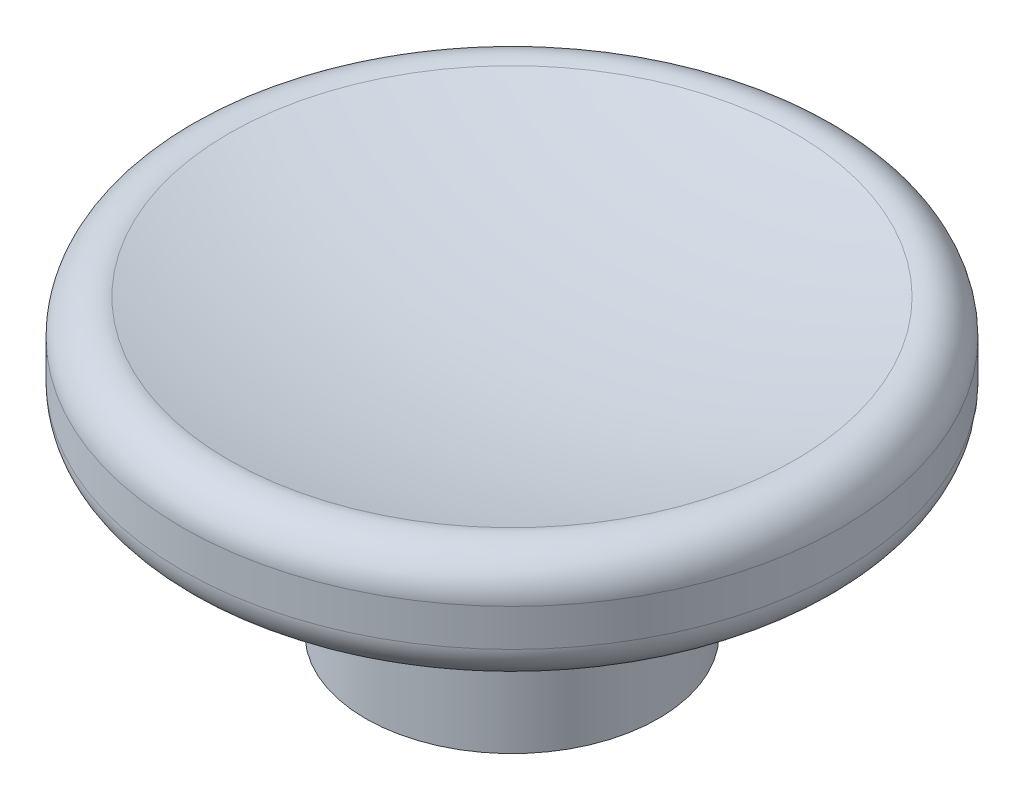
ISO-10303-21;
HEADER;
FILE_DESCRIPTION(('STEP AP214'),'2;1');
FILE_NAME('part.step','',(''),(''),'','','');
FILE_SCHEMA(('AUTOMOTIVE_DESIGN { 1 0 10303 214 1 1 1 1 }'));
ENDSEC;
DATA;
#1=APPLICATION_CONTEXT('core data for automotive mechanical design processes');
#2=APPLICATION_PROTOCOL_DEFINITION('international standard','automotive_design',2000,#1);
#3=PRODUCT_CONTEXT('',#1,'mechanical');
#4=PRODUCT('Part','Part','',(#3));
#5=PRODUCT_RELATED_PRODUCT_CATEGORY('part','',(#4));
#6=PRODUCT_DEFINITION_FORMATION('','',#4);
#7=PRODUCT_DEFINITION_CONTEXT('part definition',#1,'design');
#8=PRODUCT_DEFINITION('design','',#6,#7);
#9=PRODUCT_DEFINITION_SHAPE('','',#8);
#10=(LENGTH_UNIT() NAMED_UNIT(*) SI_UNIT(.MILLI.,.METRE.));
#11=(NAMED_UNIT(*) PLANE_ANGLE_UNIT() SI_UNIT($,.RADIAN.));
#12=(NAMED_UNIT(*) SI_UNIT($,.STERADIAN.) SOLID_ANGLE_UNIT());
#13=UNCERTAINTY_MEASURE_WITH_UNIT(LENGTH_MEASURE(1.E-05),#10,'distance_accuracy_value','');
#14=(GEOMETRIC_REPRESENTATION_CONTEXT(3) GLOBAL_UNCERTAINTY_ASSIGNED_CONTEXT((#13)) GLOBAL_UNIT_ASSIGNED_CONTEXT((#10,
#11,#12)) REPRESENTATION_CONTEXT('',''));
#15=CARTESIAN_POINT('',(0.,0.,0.));
#16=DIRECTION('',(0.,0.,1.));
#17=DIRECTION('',(1.,0.,0.));
#18=AXIS2_PLACEMENT_3D('',#15,#16,#17);
#19=CARTESIAN_POINT('',(0.,0.,0.));
#20=DIRECTION('',(0.,1.,0.));
#21=DIRECTION('',(0.,0.,1.));
#22=AXIS2_PLACEMENT_3D('',#19,#20,#21);
#23=PLANE('',#22);
#24=CARTESIAN_POINT('',(0.,0.,0.));
#25=DIRECTION('',(0.,1.,0.));
#26=DIRECTION('',(0.,0.,1.));
#27=AXIS2_PLACEMENT_3D('',#24,#25,#26);
#28=CIRCLE('',#27,2.);
#29=CARTESIAN_POINT('',(0.,0.,2.));
#30=VERTEX_POINT('',#29);
#31=EDGE_CURVE('E114',#30,#30,#28,.T.);
#32=ORIENTED_EDGE('',*,*,#31,.F.);
#33=EDGE_LOOP('',(#32));
#34=FACE_BOUND('',#33,.T.);
#35=DIRECTION('',(0.,0.,-1.));
#36=VECTOR('',#35,1.);
#37=CARTESIAN_POINT('',(0.927797891501665,0.,0.95));
#38=LINE('',#37,#36);
#39=CARTESIAN_POINT('',(0.927797891501665,0.,0.95));
#40=VERTEX_POINT('',#39);
#41=CARTESIAN_POINT('',(0.927797891501665,0.,-0.95));
#42=VERTEX_POINT('',#41);
#43=EDGE_CURVE('E97',#40,#42,#38,.T.);
#44=ORIENTED_EDGE('',*,*,#43,.T.);
#45=DIRECTION('',(-1.,0.,0.));
#46=VECTOR('',#45,1.);
#47=CARTESIAN_POINT('',(-0.927797891501665,0.,-0.95));
#48=LINE('',#47,#46);
#49=CARTESIAN_POINT('',(-0.927797891501665,0.,-0.95));
#50=VERTEX_POINT('',#49);
#51=EDGE_CURVE('E100',#42,#50,#48,.T.);
#52=ORIENTED_EDGE('',*,*,#51,.T.);
#53=DIRECTION('',(0.,0.,1.));
#54=VECTOR('',#53,1.);
#55=CARTESIAN_POINT('',(-0.927797891501665,0.,0.95));
#56=LINE('',#55,#54);
#57=CARTESIAN_POINT('',(-0.927797891501665,0.,0.95));
#58=VERTEX_POINT('',#57);
#59=EDGE_CURVE('E107',#50,#58,#56,.T.);
#60=ORIENTED_EDGE('',*,*,#59,.T.);
#61=DIRECTION('',(1.,0.,0.));
#62=VECTOR('',#61,1.);
#63=CARTESIAN_POINT('',(-0.927797891501665,0.,0.95));
#64=LINE('',#63,#62);
#65=EDGE_CURVE('E84',#58,#40,#64,.T.);
#66=ORIENTED_EDGE('',*,*,#65,.T.);
#67=EDGE_LOOP('',(#44,#52,#60,#66));
#68=FACE_BOUND('',#67,.T.);
#69=ADVANCED_FACE('F37',(#34,#68),#23,.F.);
#70=CARTESIAN_POINT('',(0.,2.5,0.));
#71=DIRECTION('',(0.,-1.,0.));
#72=DIRECTION('',(0.,0.,-1.));
#73=AXIS2_PLACEMENT_3D('',#70,#71,#72);
#74=CYLINDRICAL_SURFACE('',#73,2.);
#75=CARTESIAN_POINT('',(0.,2.,0.));
#76=DIRECTION('',(0.,1.,0.));
#77=DIRECTION('',(0.,0.,1.));
#78=AXIS2_PLACEMENT_3D('',#75,#76,#77);
#79=CIRCLE('',#78,2.);
#80=CARTESIAN_POINT('',(0.,2.,2.));
#81=VERTEX_POINT('',#80);
#82=EDGE_CURVE('E123',#81,#81,#79,.F.);
#83=ORIENTED_EDGE('',*,*,#82,.T.);
#84=EDGE_LOOP('',(#83));
#85=FACE_BOUND('',#84,.T.);
#86=ORIENTED_EDGE('',*,*,#31,.T.);
#87=EDGE_LOOP('',(#86));
#88=FACE_BOUND('',#87,.T.);
#89=ADVANCED_FACE('F148',(#85,#88),#74,.T.);
#90=CARTESIAN_POINT('',(0.927797891501665,2.5,0.95));
#91=DIRECTION('',(-1.,0.,0.));
#92=DIRECTION('',(0.,0.,1.));
#93=AXIS2_PLACEMENT_3D('',#90,#91,#92);
#94=PLANE('',#93);
#95=DIRECTION('',(0.,0.,1.));
#96=VECTOR('',#95,1.);
#97=CARTESIAN_POINT('',(0.927797891501665,2.,-0.95));
#98=LINE('',#97,#96);
#99=CARTESIAN_POINT('',(0.927797891501665,2.,-0.95));
#100=VERTEX_POINT('',#99);
#101=CARTESIAN_POINT('',(0.927797891501665,2.,0.95));
#102=VERTEX_POINT('',#101);
#103=EDGE_CURVE('E52',#100,#102,#98,.T.);
#104=ORIENTED_EDGE('',*,*,#103,.F.);
#105=DIRECTION('',(0.,-1.,0.));
#106=VECTOR('',#105,1.);
#107=CARTESIAN_POINT('',(0.927797891501665,2.5,-0.95));
#108=LINE('',#107,#106);
#109=EDGE_CURVE('E112',#100,#42,#108,.T.);
#110=ORIENTED_EDGE('',*,*,#109,.T.);
#111=ORIENTED_EDGE('',*,*,#43,.F.);
#112=DIRECTION('',(0.,-1.,0.));
#113=VECTOR('',#112,1.);
#114=CARTESIAN_POINT('',(0.927797891501665,2.5,0.95));
#115=LINE('',#114,#113);
#116=EDGE_CURVE('E89',#102,#40,#115,.T.);
#117=ORIENTED_EDGE('',*,*,#116,.F.);
#118=EDGE_LOOP('',(#104,#110,#111,#117));
#119=FACE_BOUND('',#118,.T.);
#120=ADVANCED_FACE('F154',(#119),#94,.T.);
#121=CARTESIAN_POINT('',(-0.927797891501665,2.5,-0.95));
#122=DIRECTION('',(0.,0.,1.));
#123=DIRECTION('',(1.,0.,0.));
#124=AXIS2_PLACEMENT_3D('',#121,#122,#123);
#125=PLANE('',#124);
#126=DIRECTION('',(1.,0.,0.));
#127=VECTOR('',#126,1.);
#128=CARTESIAN_POINT('',(0.927797891501665,2.,-0.95));
#129=LINE('',#128,#127);
#130=CARTESIAN_POINT('',(-0.927797891501665,2.,-0.95));
#131=VERTEX_POINT('',#130);
#132=EDGE_CURVE('E59',#131,#100,#129,.T.);
#133=ORIENTED_EDGE('',*,*,#132,.F.);
#134=DIRECTION('',(0.,-1.,0.));
#135=VECTOR('',#134,1.);
#136=CARTESIAN_POINT('',(-0.927797891501665,2.5,-0.95));
#137=LINE('',#136,#135);
#138=EDGE_CURVE('E88',#131,#50,#137,.T.);
#139=ORIENTED_EDGE('',*,*,#138,.T.);
#140=ORIENTED_EDGE('',*,*,#51,.F.);
#141=ORIENTED_EDGE('',*,*,#109,.F.);
#142=EDGE_LOOP('',(#133,#139,#140,#141));
#143=FACE_BOUND('',#142,.T.);
#144=ADVANCED_FACE('F162',(#143),#125,.T.);
#145=CARTESIAN_POINT('',(-0.927797891501665,2.5,0.95));
#146=DIRECTION('',(1.,0.,0.));
#147=DIRECTION('',(0.,0.,-1.));
#148=AXIS2_PLACEMENT_3D('',#145,#146,#147);
#149=PLANE('',#148);
#150=DIRECTION('',(0.,0.,-1.));
#151=VECTOR('',#150,1.);
#152=CARTESIAN_POINT('',(-0.927797891501665,2.,-0.95));
#153=LINE('',#152,#151);
#154=CARTESIAN_POINT('',(-0.927797891501665,2.,0.95));
#155=VERTEX_POINT('',#154);
#156=EDGE_CURVE('E92',#155,#131,#153,.T.);
#157=ORIENTED_EDGE('',*,*,#156,.F.);
#158=DIRECTION('',(0.,-1.,0.));
#159=VECTOR('',#158,1.);
#160=CARTESIAN_POINT('',(-0.927797891501665,2.5,0.95));
#161=LINE('',#160,#159);
#162=EDGE_CURVE('E78',#155,#58,#161,.T.);
#163=ORIENTED_EDGE('',*,*,#162,.T.);
#164=ORIENTED_EDGE('',*,*,#59,.F.);
#165=ORIENTED_EDGE('',*,*,#138,.F.);
#166=EDGE_LOOP('',(#157,#163,#164,#165));
#167=FACE_BOUND('',#166,.T.);
#168=ADVANCED_FACE('F93',(#167),#149,.T.);
#169=CARTESIAN_POINT('',(-0.927797891501665,2.5,0.95));
#170=DIRECTION('',(0.,0.,-1.));
#171=DIRECTION('',(-1.,0.,0.));
#172=AXIS2_PLACEMENT_3D('',#169,#170,#171);
#173=PLANE('',#172);
#174=DIRECTION('',(-1.,0.,0.));
#175=VECTOR('',#174,1.);
#176=CARTESIAN_POINT('',(0.927797891501665,2.,0.95));
#177=LINE('',#176,#175);
#178=EDGE_CURVE('E82',#102,#155,#177,.T.);
#179=ORIENTED_EDGE('',*,*,#178,.F.);
#180=ORIENTED_EDGE('',*,*,#116,.T.);
#181=ORIENTED_EDGE('',*,*,#65,.F.);
#182=ORIENTED_EDGE('',*,*,#162,.F.);
#183=EDGE_LOOP('',(#179,#180,#181,#182));
#184=FACE_BOUND('',#183,.T.);
#185=ADVANCED_FACE('F80',(#184),#173,.T.);
#186=CARTESIAN_POINT('',(0.,2.5,0.));
#187=DIRECTION('',(0.,1.,0.));
#188=DIRECTION('',(0.,0.,1.));
#189=AXIS2_PLACEMENT_3D('',#186,#187,#188);
#190=PLANE('',#189);
#191=CARTESIAN_POINT('',(0.,2.5,0.));
#192=DIRECTION('',(0.,1.,0.));
#193=DIRECTION('',(0.,0.,1.));
#194=AXIS2_PLACEMENT_3D('',#191,#192,#193);
#195=CIRCLE('',#194,2.5);
#196=CARTESIAN_POINT('',(0.,2.5,2.5));
#197=VERTEX_POINT('',#196);
#198=EDGE_CURVE('E120',#197,#197,#195,.T.);
#199=ORIENTED_EDGE('',*,*,#198,.T.);
#200=EDGE_LOOP('',(#199));
#201=FACE_BOUND('',#200,.T.);
#202=CARTESIAN_POINT('',(0.,2.5,0.));
#203=DIRECTION('',(0.,1.,0.));
#204=DIRECTION('',(0.,0.,1.));
#205=AXIS2_PLACEMENT_3D('',#202,#203,#204);
#206=CIRCLE('',#205,4.);
#207=CARTESIAN_POINT('',(0.,2.5,4.));
#208=VERTEX_POINT('',#207);
#209=EDGE_CURVE('E117',#208,#208,#206,.F.);
#210=ORIENTED_EDGE('',*,*,#209,.T.);
#211=EDGE_LOOP('',(#210));
#212=FACE_BOUND('',#211,.T.);
#213=ADVANCED_FACE('F169',(#201,#212),#190,.F.);
#214=CARTESIAN_POINT('',(0.,4.5,0.));
#215=DIRECTION('',(0.,-1.,0.));
#216=DIRECTION('',(0.,0.,-1.));
#217=AXIS2_PLACEMENT_3D('',#214,#215,#216);
#218=CYLINDRICAL_SURFACE('',#217,4.5);
#219=CARTESIAN_POINT('',(0.,3.,0.));
#220=DIRECTION('',(0.,1.,0.));
#221=DIRECTION('',(0.,0.,1.));
#222=AXIS2_PLACEMENT_3D('',#219,#220,#221);
#223=CIRCLE('',#222,4.5);
#224=CARTESIAN_POINT('',(0.,3.,4.5));
#225=VERTEX_POINT('',#224);
#226=EDGE_CURVE('E45',#225,#225,#223,.T.);
#227=ORIENTED_EDGE('',*,*,#226,.T.);
#228=EDGE_LOOP('',(#227));
#229=FACE_BOUND('',#228,.T.);
#230=CARTESIAN_POINT('',(0.,3.50890624832743,0.));
#231=DIRECTION('',(0.,1.,0.));
#232=DIRECTION('',(0.,0.,1.));
#233=AXIS2_PLACEMENT_3D('',#230,#231,#232);
#234=CIRCLE('',#233,4.5);
#235=CARTESIAN_POINT('',(0.,3.50890624832743,4.5));
#236=VERTEX_POINT('',#235);
#237=EDGE_CURVE('E126',#236,#236,#234,.F.);
#238=ORIENTED_EDGE('',*,*,#237,.T.);
#239=EDGE_LOOP('',(#238));
#240=FACE_BOUND('',#239,.T.);
#241=ADVANCED_FACE('F131',(#229,#240),#218,.T.);
#242=CARTESIAN_POINT('',(0.,17.6542234946814,0.));
#243=DIRECTION('',(0.,1.,0.));
#244=DIRECTION('',(-1.,0.,0.));
#245=AXIS2_PLACEMENT_3D('',#242,#243,#244);
#246=SPHERICAL_SURFACE('',#245,14.2);
#247=CARTESIAN_POINT('',(0.,3.99003948799933,0.));
#248=DIRECTION('',(0.,1.,0.));
#249=DIRECTION('',(0.,0.,1.));
#250=AXIS2_PLACEMENT_3D('',#247,#248,#249);
#251=CIRCLE('',#250,3.86394557823129);
#252=CARTESIAN_POINT('',(0.,3.99003948799933,3.86394557823129));
#253=VERTEX_POINT('',#252);
#254=EDGE_CURVE('E11',#253,#253,#251,.T.);
#255=ORIENTED_EDGE('',*,*,#254,.T.);
#256=EDGE_LOOP('',(#255));
#257=FACE_BOUND('',#256,.T.);
#258=ADVANCED_FACE('F143',(#257),#246,.F.);
#259=CARTESIAN_POINT('',(0.,2.,0.));
#260=DIRECTION('',(0.,1.,0.));
#261=DIRECTION('',(0.,0.,1.));
#262=AXIS2_PLACEMENT_3D('',#259,#260,#261);
#263=TOROIDAL_SURFACE('',#262,2.5,0.5);
#264=ORIENTED_EDGE('',*,*,#82,.F.);
#265=EDGE_LOOP('',(#264));
#266=FACE_BOUND('',#265,.T.);
#267=ORIENTED_EDGE('',*,*,#198,.F.);
#268=EDGE_LOOP('',(#267));
#269=FACE_BOUND('',#268,.T.);
#270=ADVANCED_FACE('F136',(#266,#269),#263,.F.);
#271=CARTESIAN_POINT('',(0.,3.,0.));
#272=DIRECTION('',(0.,1.,0.));
#273=DIRECTION('',(0.,0.,1.));
#274=AXIS2_PLACEMENT_3D('',#271,#272,#273);
#275=TOROIDAL_SURFACE('',#274,4.,0.5);
#276=ORIENTED_EDGE('',*,*,#209,.F.);
#277=EDGE_LOOP('',(#276));
#278=FACE_BOUND('',#277,.T.);
#279=ORIENTED_EDGE('',*,*,#226,.F.);
#280=EDGE_LOOP('',(#279));
#281=FACE_BOUND('',#280,.T.);
#282=ADVANCED_FACE('F134',(#278,#281),#275,.T.);
#283=CARTESIAN_POINT('',(0.,3.50890624832743,0.));
#284=DIRECTION('',(0.,1.,0.));
#285=DIRECTION('',(0.,0.,1.));
#286=AXIS2_PLACEMENT_3D('',#283,#284,#285);
#287=TOROIDAL_SURFACE('',#286,4.,0.5);
#288=ORIENTED_EDGE('',*,*,#254,.F.);
#289=EDGE_LOOP('',(#288));
#290=FACE_BOUND('',#289,.T.);
#291=ORIENTED_EDGE('',*,*,#237,.F.);
#292=EDGE_LOOP('',(#291));
#293=FACE_BOUND('',#292,.T.);
#294=ADVANCED_FACE('F39',(#290,#293),#287,.T.);
#295=CARTESIAN_POINT('',(0.,2.,0.));
#296=DIRECTION('',(0.,-1.,0.));
#297=DIRECTION('',(0.,0.,-1.));
#298=AXIS2_PLACEMENT_3D('',#295,#296,#297);
#299=PLANE('',#298);
#300=ORIENTED_EDGE('',*,*,#156,.T.);
#301=ORIENTED_EDGE('',*,*,#132,.T.);
#302=ORIENTED_EDGE('',*,*,#103,.T.);
#303=ORIENTED_EDGE('',*,*,#178,.T.);
#304=EDGE_LOOP('',(#300,#301,#302,#303));
#305=FACE_BOUND('',#304,.T.);
#306=ADVANCED_FACE('F96',(#305),#299,.T.);
#307=CLOSED_SHELL('',(#69,#89,#120,#144,#168,#185,#213,#241,#258,#270,#282,#294,#306));
#308=MANIFOLD_SOLID_BREP('B2',#307);
#309=ADVANCED_BREP_SHAPE_REPRESENTATION('',(#18,#308),#14);
#310=SHAPE_DEFINITION_REPRESENTATION(#9,#309);
ENDSEC;
END-ISO-10303-21;
